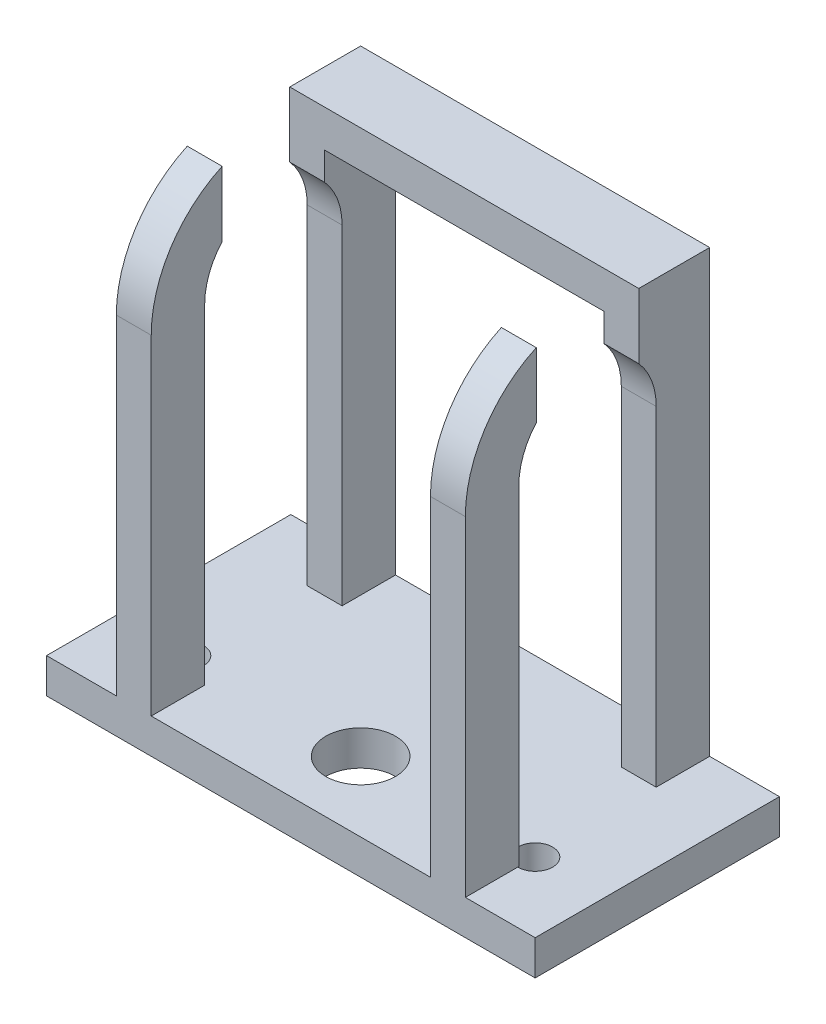
ISO-10303-21;
HEADER;
FILE_DESCRIPTION(('STEP AP214'),'2;1');
FILE_NAME('part.step','',(''),(''),'','','');
FILE_SCHEMA(('AUTOMOTIVE_DESIGN { 1 0 10303 214 1 1 1 1 }'));
ENDSEC;
DATA;
#1=APPLICATION_CONTEXT('core data for automotive mechanical design processes');
#2=APPLICATION_PROTOCOL_DEFINITION('international standard','automotive_design',2000,#1);
#3=PRODUCT_CONTEXT('',#1,'mechanical');
#4=PRODUCT('Part','Part','',(#3));
#5=PRODUCT_RELATED_PRODUCT_CATEGORY('part','',(#4));
#6=PRODUCT_DEFINITION_FORMATION('','',#4);
#7=PRODUCT_DEFINITION_CONTEXT('part definition',#1,'design');
#8=PRODUCT_DEFINITION('design','',#6,#7);
#9=PRODUCT_DEFINITION_SHAPE('','',#8);
#10=(LENGTH_UNIT() NAMED_UNIT(*) SI_UNIT(.MILLI.,.METRE.));
#11=(NAMED_UNIT(*) PLANE_ANGLE_UNIT() SI_UNIT($,.RADIAN.));
#12=(NAMED_UNIT(*) SI_UNIT($,.STERADIAN.) SOLID_ANGLE_UNIT());
#13=UNCERTAINTY_MEASURE_WITH_UNIT(LENGTH_MEASURE(1.E-05),#10,'distance_accuracy_value','');
#14=(GEOMETRIC_REPRESENTATION_CONTEXT(3) GLOBAL_UNCERTAINTY_ASSIGNED_CONTEXT((#13)) GLOBAL_UNIT_ASSIGNED_CONTEXT((#10,
#11,#12)) REPRESENTATION_CONTEXT('',''));
#15=CARTESIAN_POINT('',(0.,0.,0.));
#16=DIRECTION('',(0.,0.,1.));
#17=DIRECTION('',(1.,0.,0.));
#18=AXIS2_PLACEMENT_3D('',#15,#16,#17);
#19=CARTESIAN_POINT('',(-31.75,6.35,12.7));
#20=DIRECTION('',(0.,-1.,0.));
#21=DIRECTION('',(0.,0.,-1.));
#22=AXIS2_PLACEMENT_3D('',#19,#20,#21);
#23=PLANE('',#22);
#24=DIRECTION('',(0.,0.,-1.));
#25=VECTOR('',#24,1.);
#26=CARTESIAN_POINT('',(-31.75,6.35,12.7));
#27=LINE('',#26,#25);
#28=CARTESIAN_POINT('',(-31.75,6.35,3.175));
#29=VERTEX_POINT('',#28);
#30=CARTESIAN_POINT('',(-31.75,6.35,2.97499999999997));
#31=VERTEX_POINT('',#30);
#32=EDGE_CURVE('E618',#29,#31,#27,.T.);
#33=ORIENTED_EDGE('',*,*,#32,.T.);
#34=DIRECTION('',(-1.,0.,0.));
#35=VECTOR('',#34,1.);
#36=CARTESIAN_POINT('',(90.4,6.35,2.97499999999997));
#37=LINE('',#36,#35);
#38=CARTESIAN_POINT('',(-30.640946349359,6.35,2.97499999999997));
#39=VERTEX_POINT('',#38);
#40=EDGE_CURVE('E597',#39,#31,#37,.T.);
#41=ORIENTED_EDGE('',*,*,#40,.F.);
#42=CARTESIAN_POINT('',(-31.75,6.35,0.));
#43=DIRECTION('',(0.,1.,0.));
#44=DIRECTION('',(0.,0.,1.));
#45=AXIS2_PLACEMENT_3D('',#42,#43,#44);
#46=CIRCLE('',#45,3.175);
#47=EDGE_CURVE('E423',#29,#39,#46,.T.);
#48=ORIENTED_EDGE('',*,*,#47,.F.);
#49=EDGE_LOOP('',(#33,#41,#48));
#50=FACE_BOUND('',#49,.T.);
#51=ADVANCED_FACE('F176',(#50),#23,.T.);
#52=CARTESIAN_POINT('',(-31.75,0.,0.));
#53=DIRECTION('',(-1.,0.,0.));
#54=DIRECTION('',(0.,0.,-1.));
#55=AXIS2_PLACEMENT_3D('',#52,#53,#54);
#56=PLANE('',#55);
#57=CARTESIAN_POINT('',(-31.75,66.35,-9.52500000000002));
#58=DIRECTION('',(1.,0.,0.));
#59=DIRECTION('',(0.,0.,-1.));
#60=AXIS2_PLACEMENT_3D('',#57,#58,#59);
#61=CIRCLE('',#60,12.5);
#62=CARTESIAN_POINT('',(-31.75,74.6743242969024,-0.199999999999997));
#63=VERTEX_POINT('',#62);
#64=CARTESIAN_POINT('',(-31.75,66.35,2.97499999999998));
#65=VERTEX_POINT('',#64);
#66=EDGE_CURVE('E580',#63,#65,#61,.T.);
#67=ORIENTED_EDGE('',*,*,#66,.T.);
#68=DIRECTION('',(0.,-1.,0.));
#69=VECTOR('',#68,1.);
#70=CARTESIAN_POINT('',(-31.75,66.35,2.97499999999998));
#71=LINE('',#70,#69);
#72=EDGE_CURVE('E587',#65,#31,#71,.T.);
#73=ORIENTED_EDGE('',*,*,#72,.T.);
#74=ORIENTED_EDGE('',*,*,#32,.F.);
#75=CARTESIAN_POINT('',(-31.75,6.35,12.7));
#76=VERTEX_POINT('',#75);
#77=EDGE_CURVE('E559',#76,#29,#27,.T.);
#78=ORIENTED_EDGE('',*,*,#77,.F.);
#79=DIRECTION('',(0.,1.,0.));
#80=VECTOR('',#79,1.);
#81=CARTESIAN_POINT('',(-31.75,6.35,12.7));
#82=LINE('',#81,#80);
#83=CARTESIAN_POINT('',(-31.75,66.35,12.7));
#84=VERTEX_POINT('',#83);
#85=EDGE_CURVE('E613',#76,#84,#82,.T.);
#86=ORIENTED_EDGE('',*,*,#85,.T.);
#87=CARTESIAN_POINT('',(-31.75,66.35,-9.52500000000002));
#88=DIRECTION('',(1.,0.,0.));
#89=DIRECTION('',(0.,0.,-1.));
#90=AXIS2_PLACEMENT_3D('',#87,#88,#89);
#91=CIRCLE('',#90,22.225);
#92=CARTESIAN_POINT('',(-31.75,86.5241170810522,-0.200000000000002));
#93=VERTEX_POINT('',#92);
#94=EDGE_CURVE('E609',#93,#84,#91,.T.);
#95=ORIENTED_EDGE('',*,*,#94,.F.);
#96=DIRECTION('',(0.,1.,0.));
#97=VECTOR('',#96,1.);
#98=CARTESIAN_POINT('',(-31.75,74.6743242969024,-0.199999999999999));
#99=LINE('',#98,#97);
#100=EDGE_CURVE('E565',#63,#93,#99,.T.);
#101=ORIENTED_EDGE('',*,*,#100,.F.);
#102=EDGE_LOOP('',(#67,#73,#74,#78,#86,#95,#101));
#103=FACE_BOUND('',#102,.T.);
#104=ADVANCED_FACE('F651',(#103),#56,.T.);
#105=CARTESIAN_POINT('',(-25.4,0.,0.));
#106=DIRECTION('',(-1.,0.,0.));
#107=DIRECTION('',(0.,0.,-1.));
#108=AXIS2_PLACEMENT_3D('',#105,#106,#107);
#109=PLANE('',#108);
#110=DIRECTION('',(0.,1.,0.));
#111=VECTOR('',#110,1.);
#112=CARTESIAN_POINT('',(-25.4,66.35,2.97499999999998));
#113=LINE('',#112,#111);
#114=CARTESIAN_POINT('',(-25.4,6.35,2.97499999999997));
#115=VERTEX_POINT('',#114);
#116=CARTESIAN_POINT('',(-25.4,66.35,2.97499999999998));
#117=VERTEX_POINT('',#116);
#118=EDGE_CURVE('E591',#115,#117,#113,.T.);
#119=ORIENTED_EDGE('',*,*,#118,.T.);
#120=CARTESIAN_POINT('',(-25.4,66.35,-9.52500000000002));
#121=DIRECTION('',(-1.,0.,0.));
#122=DIRECTION('',(0.,0.,1.));
#123=AXIS2_PLACEMENT_3D('',#120,#121,#122);
#124=CIRCLE('',#123,12.5);
#125=CARTESIAN_POINT('',(-25.4,74.6743242969024,-0.199999999999999));
#126=VERTEX_POINT('',#125);
#127=EDGE_CURVE('E583',#117,#126,#124,.T.);
#128=ORIENTED_EDGE('',*,*,#127,.T.);
#129=DIRECTION('',(0.,-1.,0.));
#130=VECTOR('',#129,1.);
#131=CARTESIAN_POINT('',(-25.4,74.6743242969024,-0.199999999999999));
#132=LINE('',#131,#130);
#133=CARTESIAN_POINT('',(-25.4,86.5241170810522,-0.199999999999999));
#134=VERTEX_POINT('',#133);
#135=EDGE_CURVE('E570',#134,#126,#132,.T.);
#136=ORIENTED_EDGE('',*,*,#135,.F.);
#137=CARTESIAN_POINT('',(-25.4,66.35,-9.52500000000002));
#138=DIRECTION('',(1.,0.,0.));
#139=DIRECTION('',(0.,0.,-1.));
#140=AXIS2_PLACEMENT_3D('',#137,#138,#139);
#141=CIRCLE('',#140,22.225);
#142=CARTESIAN_POINT('',(-25.4,66.35,12.7));
#143=VERTEX_POINT('',#142);
#144=EDGE_CURVE('E590',#134,#143,#141,.T.);
#145=ORIENTED_EDGE('',*,*,#144,.T.);
#146=DIRECTION('',(0.,1.,0.));
#147=VECTOR('',#146,1.);
#148=CARTESIAN_POINT('',(-25.4,6.35,12.7));
#149=LINE('',#148,#147);
#150=CARTESIAN_POINT('',(-25.4,6.35,12.7));
#151=VERTEX_POINT('',#150);
#152=EDGE_CURVE('E611',#151,#143,#149,.T.);
#153=ORIENTED_EDGE('',*,*,#152,.F.);
#154=DIRECTION('',(0.,0.,-1.));
#155=VECTOR('',#154,1.);
#156=CARTESIAN_POINT('',(-25.4,6.35,12.7));
#157=LINE('',#156,#155);
#158=EDGE_CURVE('E623',#151,#115,#157,.T.);
#159=ORIENTED_EDGE('',*,*,#158,.T.);
#160=EDGE_LOOP('',(#119,#128,#136,#145,#153,#159));
#161=FACE_BOUND('',#160,.T.);
#162=ADVANCED_FACE('F697',(#161),#109,.F.);
#163=CARTESIAN_POINT('',(-31.75,66.35,-9.52500000000002));
#164=DIRECTION('',(1.,0.,0.));
#165=DIRECTION('',(0.,0.,-1.));
#166=AXIS2_PLACEMENT_3D('',#163,#164,#165);
#167=CYLINDRICAL_SURFACE('',#166,22.225);
#168=DIRECTION('',(1.,0.,0.));
#169=VECTOR('',#168,1.);
#170=CARTESIAN_POINT('',(-31.75,86.5241170810522,-0.199999999999999));
#171=LINE('',#170,#169);
#172=EDGE_CURVE('E12',#93,#134,#171,.T.);
#173=ORIENTED_EDGE('',*,*,#172,.F.);
#174=ORIENTED_EDGE('',*,*,#94,.T.);
#175=DIRECTION('',(1.,0.,0.));
#176=VECTOR('',#175,1.);
#177=CARTESIAN_POINT('',(-31.75,66.35,12.7));
#178=LINE('',#177,#176);
#179=EDGE_CURVE('E490',#84,#143,#178,.T.);
#180=ORIENTED_EDGE('',*,*,#179,.T.);
#181=ORIENTED_EDGE('',*,*,#144,.F.);
#182=EDGE_LOOP('',(#173,#174,#180,#181));
#183=FACE_BOUND('',#182,.T.);
#184=ADVANCED_FACE('F755',(#183),#167,.T.);
#185=CARTESIAN_POINT('',(25.4,0.,0.));
#186=DIRECTION('',(1.,0.,0.));
#187=DIRECTION('',(0.,0.,-1.));
#188=AXIS2_PLACEMENT_3D('',#185,#186,#187);
#189=PLANE('',#188);
#190=DIRECTION('',(0.,-1.,0.));
#191=VECTOR('',#190,1.);
#192=CARTESIAN_POINT('',(25.4,74.6743242969024,-18.85));
#193=LINE('',#192,#191);
#194=CARTESIAN_POINT('',(25.4,79.7543242969024,-18.85));
#195=VERTEX_POINT('',#194);
#196=CARTESIAN_POINT('',(25.4,74.6743242969024,-18.85));
#197=VERTEX_POINT('',#196);
#198=EDGE_CURVE('E387',#195,#197,#193,.T.);
#199=ORIENTED_EDGE('',*,*,#198,.F.);
#200=DIRECTION('',(0.,0.,-1.));
#201=VECTOR('',#200,1.);
#202=CARTESIAN_POINT('',(25.4,79.7543242969024,0.));
#203=LINE('',#202,#201);
#204=CARTESIAN_POINT('',(25.4,79.7543242969024,-31.75));
#205=VERTEX_POINT('',#204);
#206=EDGE_CURVE('E375',#195,#205,#203,.T.);
#207=ORIENTED_EDGE('',*,*,#206,.T.);
#208=DIRECTION('',(0.,1.,0.));
#209=VECTOR('',#208,1.);
#210=CARTESIAN_POINT('',(25.4,6.35000000000001,-31.75));
#211=LINE('',#210,#209);
#212=CARTESIAN_POINT('',(25.4,6.35,-31.75));
#213=VERTEX_POINT('',#212);
#214=EDGE_CURVE('E385',#213,#205,#211,.T.);
#215=ORIENTED_EDGE('',*,*,#214,.F.);
#216=DIRECTION('',(0.,0.,-1.));
#217=VECTOR('',#216,1.);
#218=CARTESIAN_POINT('',(25.4,6.35,12.7));
#219=LINE('',#218,#217);
#220=CARTESIAN_POINT('',(25.4,6.35,-22.025));
#221=VERTEX_POINT('',#220);
#222=EDGE_CURVE('E394',#221,#213,#219,.T.);
#223=ORIENTED_EDGE('',*,*,#222,.F.);
#224=DIRECTION('',(0.,1.,0.));
#225=VECTOR('',#224,1.);
#226=CARTESIAN_POINT('',(25.4,66.35,-22.025));
#227=LINE('',#226,#225);
#228=CARTESIAN_POINT('',(25.4,66.35,-22.025));
#229=VERTEX_POINT('',#228);
#230=EDGE_CURVE('E500',#221,#229,#227,.T.);
#231=ORIENTED_EDGE('',*,*,#230,.T.);
#232=CARTESIAN_POINT('',(25.4,66.35,-9.52500000000002));
#233=DIRECTION('',(1.,0.,0.));
#234=DIRECTION('',(0.,0.,-1.));
#235=AXIS2_PLACEMENT_3D('',#232,#233,#234);
#236=CIRCLE('',#235,12.5);
#237=EDGE_CURVE('E524',#197,#229,#236,.F.);
#238=ORIENTED_EDGE('',*,*,#237,.F.);
#239=EDGE_LOOP('',(#199,#207,#215,#223,#231,#238));
#240=FACE_BOUND('',#239,.T.);
#241=ADVANCED_FACE('F383',(#240),#189,.F.);
#242=CARTESIAN_POINT('',(31.75,0.,0.));
#243=DIRECTION('',(1.,0.,0.));
#244=DIRECTION('',(0.,0.,-1.));
#245=AXIS2_PLACEMENT_3D('',#242,#243,#244);
#246=PLANE('',#245);
#247=DIRECTION('',(0.,1.,0.));
#248=VECTOR('',#247,1.);
#249=CARTESIAN_POINT('',(31.75,6.35000000000001,-31.75));
#250=LINE('',#249,#248);
#251=CARTESIAN_POINT('',(31.75,6.35000000000001,-31.75));
#252=VERTEX_POINT('',#251);
#253=CARTESIAN_POINT('',(31.75,86.5241170810522,-31.75));
#254=VERTEX_POINT('',#253);
#255=EDGE_CURVE('E409',#252,#254,#250,.T.);
#256=ORIENTED_EDGE('',*,*,#255,.T.);
#257=DIRECTION('',(0.,0.,-1.));
#258=VECTOR('',#257,1.);
#259=CARTESIAN_POINT('',(31.75,86.5241170810522,-18.85));
#260=LINE('',#259,#258);
#261=CARTESIAN_POINT('',(31.75,86.5241170810522,-18.85));
#262=VERTEX_POINT('',#261);
#263=EDGE_CURVE('E478',#262,#254,#260,.T.);
#264=ORIENTED_EDGE('',*,*,#263,.F.);
#265=DIRECTION('',(0.,1.,0.));
#266=VECTOR('',#265,1.);
#267=CARTESIAN_POINT('',(31.75,74.6743242969024,-18.85));
#268=LINE('',#267,#266);
#269=CARTESIAN_POINT('',(31.75,74.6743242969024,-18.85));
#270=VERTEX_POINT('',#269);
#271=EDGE_CURVE('E486',#270,#262,#268,.T.);
#272=ORIENTED_EDGE('',*,*,#271,.F.);
#273=CARTESIAN_POINT('',(31.75,66.35,-9.52500000000002));
#274=DIRECTION('',(1.,0.,0.));
#275=DIRECTION('',(0.,0.,-1.));
#276=AXIS2_PLACEMENT_3D('',#273,#274,#275);
#277=CIRCLE('',#276,12.5);
#278=CARTESIAN_POINT('',(31.75,66.35,-22.025));
#279=VERTEX_POINT('',#278);
#280=EDGE_CURVE('E519',#279,#270,#277,.T.);
#281=ORIENTED_EDGE('',*,*,#280,.F.);
#282=DIRECTION('',(0.,-1.,0.));
#283=VECTOR('',#282,1.);
#284=CARTESIAN_POINT('',(31.75,66.35,-22.025));
#285=LINE('',#284,#283);
#286=CARTESIAN_POINT('',(31.75,6.35,-22.025));
#287=VERTEX_POINT('',#286);
#288=EDGE_CURVE('E501',#279,#287,#285,.T.);
#289=ORIENTED_EDGE('',*,*,#288,.T.);
#290=DIRECTION('',(0.,0.,-1.));
#291=VECTOR('',#290,1.);
#292=CARTESIAN_POINT('',(31.75,6.35,12.7));
#293=LINE('',#292,#291);
#294=EDGE_CURVE('E470',#287,#252,#293,.T.);
#295=ORIENTED_EDGE('',*,*,#294,.T.);
#296=EDGE_LOOP('',(#256,#264,#272,#281,#289,#295));
#297=FACE_BOUND('',#296,.T.);
#298=ADVANCED_FACE('F484',(#297),#246,.T.);
#299=CARTESIAN_POINT('',(31.75,66.35,-9.52500000000002));
#300=DIRECTION('',(-1.,0.,0.));
#301=DIRECTION('',(0.,0.,1.));
#302=AXIS2_PLACEMENT_3D('',#299,#300,#301);
#303=CYLINDRICAL_SURFACE('',#302,22.225);
#304=DIRECTION('',(-1.,0.,0.));
#305=VECTOR('',#304,1.);
#306=CARTESIAN_POINT('',(31.75,86.5241170810522,-0.199999999999999));
#307=LINE('',#306,#305);
#308=CARTESIAN_POINT('',(25.4,86.5241170810522,-0.200000000000002));
#309=VERTEX_POINT('',#308);
#310=CARTESIAN_POINT('',(31.75,86.5241170810522,-0.199999999999999));
#311=VERTEX_POINT('',#310);
#312=EDGE_CURVE('E471',#309,#311,#307,.F.);
#313=ORIENTED_EDGE('',*,*,#312,.F.);
#314=CARTESIAN_POINT('',(25.4,66.35,-9.52500000000002));
#315=DIRECTION('',(1.,0.,0.));
#316=DIRECTION('',(0.,0.,-1.));
#317=AXIS2_PLACEMENT_3D('',#314,#315,#316);
#318=CIRCLE('',#317,22.225);
#319=CARTESIAN_POINT('',(25.4,66.35,12.7));
#320=VERTEX_POINT('',#319);
#321=EDGE_CURVE('E399',#309,#320,#318,.T.);
#322=ORIENTED_EDGE('',*,*,#321,.T.);
#323=DIRECTION('',(-1.,0.,0.));
#324=VECTOR('',#323,1.);
#325=CARTESIAN_POINT('',(31.75,66.35,12.7));
#326=LINE('',#325,#324);
#327=CARTESIAN_POINT('',(31.75,66.35,12.7));
#328=VERTEX_POINT('',#327);
#329=EDGE_CURVE('E410',#328,#320,#326,.T.);
#330=ORIENTED_EDGE('',*,*,#329,.F.);
#331=CARTESIAN_POINT('',(31.75,66.35,-9.52500000000002));
#332=DIRECTION('',(1.,0.,0.));
#333=DIRECTION('',(0.,0.,-1.));
#334=AXIS2_PLACEMENT_3D('',#331,#332,#333);
#335=CIRCLE('',#334,22.225);
#336=EDGE_CURVE('E395',#311,#328,#335,.T.);
#337=ORIENTED_EDGE('',*,*,#336,.F.);
#338=EDGE_LOOP('',(#313,#322,#330,#337));
#339=FACE_BOUND('',#338,.T.);
#340=ADVANCED_FACE('F728',(#339),#303,.T.);
#341=CARTESIAN_POINT('',(0.,6.35,0.));
#342=DIRECTION('',(0.,-1.,0.));
#343=DIRECTION('',(0.,0.,-1.));
#344=AXIS2_PLACEMENT_3D('',#341,#342,#343);
#345=PLANE('',#344);
#346=DIRECTION('',(1.,0.,0.));
#347=VECTOR('',#346,1.);
#348=CARTESIAN_POINT('',(-44.45,6.35,12.7));
#349=LINE('',#348,#347);
#350=CARTESIAN_POINT('',(-44.45,6.35,12.7));
#351=VERTEX_POINT('',#350);
#352=EDGE_CURVE('E447',#351,#76,#349,.T.);
#353=ORIENTED_EDGE('',*,*,#352,.T.);
#354=ORIENTED_EDGE('',*,*,#77,.T.);
#355=EDGE_CURVE('E427',#39,#29,#46,.T.);
#356=ORIENTED_EDGE('',*,*,#355,.F.);
#357=EDGE_CURVE('E604',#115,#39,#37,.T.);
#358=ORIENTED_EDGE('',*,*,#357,.F.);
#359=ORIENTED_EDGE('',*,*,#158,.F.);
#360=CARTESIAN_POINT('',(25.4,6.35,12.7));
#361=VERTEX_POINT('',#360);
#362=EDGE_CURVE('E451',#151,#361,#349,.T.);
#363=ORIENTED_EDGE('',*,*,#362,.T.);
#364=CARTESIAN_POINT('',(25.4,6.35,2.97499999999997));
#365=VERTEX_POINT('',#364);
#366=EDGE_CURVE('E397',#361,#365,#219,.T.);
#367=ORIENTED_EDGE('',*,*,#366,.T.);
#368=DIRECTION('',(1.,0.,0.));
#369=VECTOR('',#368,1.);
#370=CARTESIAN_POINT('',(-39.6,6.35,2.97499999999997));
#371=LINE('',#370,#369);
#372=CARTESIAN_POINT('',(30.640946349359,6.35,2.97499999999997));
#373=VERTEX_POINT('',#372);
#374=EDGE_CURVE('E508',#365,#373,#371,.T.);
#375=ORIENTED_EDGE('',*,*,#374,.T.);
#376=CARTESIAN_POINT('',(31.75,6.35,0.));
#377=DIRECTION('',(0.,1.,0.));
#378=DIRECTION('',(0.,0.,-1.));
#379=AXIS2_PLACEMENT_3D('',#376,#377,#378);
#380=CIRCLE('',#379,3.175);
#381=CARTESIAN_POINT('',(31.75,6.35,3.17499999999999));
#382=VERTEX_POINT('',#381);
#383=EDGE_CURVE('E416',#382,#373,#380,.T.);
#384=ORIENTED_EDGE('',*,*,#383,.F.);
#385=CARTESIAN_POINT('',(31.75,6.35,12.7));
#386=VERTEX_POINT('',#385);
#387=EDGE_CURVE('E538',#386,#382,#293,.T.);
#388=ORIENTED_EDGE('',*,*,#387,.F.);
#389=CARTESIAN_POINT('',(44.45,6.35,12.7));
#390=VERTEX_POINT('',#389);
#391=EDGE_CURVE('E446',#386,#390,#349,.T.);
#392=ORIENTED_EDGE('',*,*,#391,.T.);
#393=DIRECTION('',(0.,0.,-1.));
#394=VECTOR('',#393,1.);
#395=CARTESIAN_POINT('',(44.45,6.35,12.7));
#396=LINE('',#395,#394);
#397=CARTESIAN_POINT('',(44.45,6.35,-31.75));
#398=VERTEX_POINT('',#397);
#399=EDGE_CURVE('E436',#390,#398,#396,.T.);
#400=ORIENTED_EDGE('',*,*,#399,.T.);
#401=DIRECTION('',(-1.,0.,0.));
#402=VECTOR('',#401,1.);
#403=CARTESIAN_POINT('',(-44.45,6.35,-31.75));
#404=LINE('',#403,#402);
#405=EDGE_CURVE('E441',#398,#252,#404,.T.);
#406=ORIENTED_EDGE('',*,*,#405,.T.);
#407=ORIENTED_EDGE('',*,*,#294,.F.);
#408=DIRECTION('',(1.,0.,0.));
#409=VECTOR('',#408,1.);
#410=CARTESIAN_POINT('',(-39.6,6.35,-22.025));
#411=LINE('',#410,#409);
#412=EDGE_CURVE('E507',#221,#287,#411,.T.);
#413=ORIENTED_EDGE('',*,*,#412,.F.);
#414=ORIENTED_EDGE('',*,*,#222,.T.);
#415=CARTESIAN_POINT('',(-25.4,6.35000000000001,-31.75));
#416=VERTEX_POINT('',#415);
#417=EDGE_CURVE('E393',#213,#416,#404,.T.);
#418=ORIENTED_EDGE('',*,*,#417,.T.);
#419=CARTESIAN_POINT('',(-25.4,6.35,-22.025));
#420=VERTEX_POINT('',#419);
#421=EDGE_CURVE('E622',#420,#416,#157,.T.);
#422=ORIENTED_EDGE('',*,*,#421,.F.);
#423=DIRECTION('',(-1.,0.,0.));
#424=VECTOR('',#423,1.);
#425=CARTESIAN_POINT('',(90.4,6.35,-22.025));
#426=LINE('',#425,#424);
#427=CARTESIAN_POINT('',(-31.75,6.35,-22.025));
#428=VERTEX_POINT('',#427);
#429=EDGE_CURVE('E598',#420,#428,#426,.T.);
#430=ORIENTED_EDGE('',*,*,#429,.T.);
#431=CARTESIAN_POINT('',(-31.75,6.35000000000001,-31.75));
#432=VERTEX_POINT('',#431);
#433=EDGE_CURVE('E616',#428,#432,#27,.T.);
#434=ORIENTED_EDGE('',*,*,#433,.T.);
#435=CARTESIAN_POINT('',(-44.45,6.35,-31.75));
#436=VERTEX_POINT('',#435);
#437=EDGE_CURVE('E439',#432,#436,#404,.T.);
#438=ORIENTED_EDGE('',*,*,#437,.T.);
#439=DIRECTION('',(0.,0.,1.));
#440=VECTOR('',#439,1.);
#441=CARTESIAN_POINT('',(-44.45,6.35,12.7));
#442=LINE('',#441,#440);
#443=EDGE_CURVE('E444',#436,#351,#442,.T.);
#444=ORIENTED_EDGE('',*,*,#443,.T.);
#445=EDGE_LOOP('',(#353,#354,#356,#358,#359,#363,#367,#375,#384,#388,#392,#400,#406,#407,#413,
#414,#418,#422,#430,#434,#438,#444));
#446=FACE_BOUND('',#445,.T.);
#447=CARTESIAN_POINT('',(0.,6.35,0.));
#448=DIRECTION('',(0.,1.,0.));
#449=DIRECTION('',(0.,0.,1.));
#450=AXIS2_PLACEMENT_3D('',#447,#448,#449);
#451=CIRCLE('',#450,6.35);
#452=CARTESIAN_POINT('',(0.,6.35,6.35));
#453=VERTEX_POINT('',#452);
#454=EDGE_CURVE('E430',#453,#453,#451,.T.);
#455=ORIENTED_EDGE('',*,*,#454,.F.);
#456=EDGE_LOOP('',(#455));
#457=FACE_BOUND('',#456,.T.);
#458=ADVANCED_FACE('F548',(#446,#457),#345,.F.);
#459=CARTESIAN_POINT('',(0.,0.,0.));
#460=DIRECTION('',(0.,-1.,0.));
#461=DIRECTION('',(0.,0.,-1.));
#462=AXIS2_PLACEMENT_3D('',#459,#460,#461);
#463=PLANE('',#462);
#464=CARTESIAN_POINT('',(-31.75,0.,0.));
#465=DIRECTION('',(0.,1.,0.));
#466=DIRECTION('',(0.,0.,1.));
#467=AXIS2_PLACEMENT_3D('',#464,#465,#466);
#468=CIRCLE('',#467,3.175);
#469=CARTESIAN_POINT('',(-31.75,0.,3.175));
#470=VERTEX_POINT('',#469);
#471=EDGE_CURVE('E419',#470,#470,#468,.T.);
#472=ORIENTED_EDGE('',*,*,#471,.T.);
#473=EDGE_LOOP('',(#472));
#474=FACE_BOUND('',#473,.T.);
#475=DIRECTION('',(0.,0.,-1.));
#476=VECTOR('',#475,1.);
#477=CARTESIAN_POINT('',(44.45,0.,12.7));
#478=LINE('',#477,#476);
#479=CARTESIAN_POINT('',(44.45,0.,12.7));
#480=VERTEX_POINT('',#479);
#481=CARTESIAN_POINT('',(44.45,0.,-31.75));
#482=VERTEX_POINT('',#481);
#483=EDGE_CURVE('E433',#480,#482,#478,.T.);
#484=ORIENTED_EDGE('',*,*,#483,.F.);
#485=DIRECTION('',(1.,0.,0.));
#486=VECTOR('',#485,1.);
#487=CARTESIAN_POINT('',(-44.45,0.,12.7));
#488=LINE('',#487,#486);
#489=CARTESIAN_POINT('',(-44.45,0.,12.7));
#490=VERTEX_POINT('',#489);
#491=EDGE_CURVE('E440',#490,#480,#488,.T.);
#492=ORIENTED_EDGE('',*,*,#491,.F.);
#493=DIRECTION('',(0.,0.,1.));
#494=VECTOR('',#493,1.);
#495=CARTESIAN_POINT('',(-44.45,0.,12.7));
#496=LINE('',#495,#494);
#497=CARTESIAN_POINT('',(-44.45,0.,-31.75));
#498=VERTEX_POINT('',#497);
#499=EDGE_CURVE('E456',#498,#490,#496,.T.);
#500=ORIENTED_EDGE('',*,*,#499,.F.);
#501=DIRECTION('',(-1.,0.,0.));
#502=VECTOR('',#501,1.);
#503=CARTESIAN_POINT('',(-44.45,0.,-31.75));
#504=LINE('',#503,#502);
#505=EDGE_CURVE('E454',#482,#498,#504,.T.);
#506=ORIENTED_EDGE('',*,*,#505,.F.);
#507=EDGE_LOOP('',(#484,#492,#500,#506));
#508=FACE_BOUND('',#507,.T.);
#509=CARTESIAN_POINT('',(0.,0.,0.));
#510=DIRECTION('',(0.,1.,0.));
#511=DIRECTION('',(0.,0.,1.));
#512=AXIS2_PLACEMENT_3D('',#509,#510,#511);
#513=CIRCLE('',#512,6.35);
#514=CARTESIAN_POINT('',(0.,0.,6.35));
#515=VERTEX_POINT('',#514);
#516=EDGE_CURVE('E426',#515,#515,#513,.T.);
#517=ORIENTED_EDGE('',*,*,#516,.T.);
#518=EDGE_LOOP('',(#517));
#519=FACE_BOUND('',#518,.T.);
#520=CARTESIAN_POINT('',(31.75,0.,0.));
#521=DIRECTION('',(0.,1.,0.));
#522=DIRECTION('',(0.,0.,-1.));
#523=AXIS2_PLACEMENT_3D('',#520,#521,#522);
#524=CIRCLE('',#523,3.175);
#525=CARTESIAN_POINT('',(31.75,0.,-3.17500000000001));
#526=VERTEX_POINT('',#525);
#527=EDGE_CURVE('E412',#526,#526,#524,.T.);
#528=ORIENTED_EDGE('',*,*,#527,.T.);
#529=EDGE_LOOP('',(#528));
#530=FACE_BOUND('',#529,.T.);
#531=ADVANCED_FACE('F666',(#474,#508,#519,#530),#463,.T.);
#532=CARTESIAN_POINT('',(44.45,6.35,12.7));
#533=DIRECTION('',(-1.,0.,0.));
#534=DIRECTION('',(0.,0.,1.));
#535=AXIS2_PLACEMENT_3D('',#532,#533,#534);
#536=PLANE('',#535);
#537=ORIENTED_EDGE('',*,*,#483,.T.);
#538=DIRECTION('',(0.,-1.,0.));
#539=VECTOR('',#538,1.);
#540=CARTESIAN_POINT('',(44.45,6.35,-31.75));
#541=LINE('',#540,#539);
#542=EDGE_CURVE('E467',#398,#482,#541,.T.);
#543=ORIENTED_EDGE('',*,*,#542,.F.);
#544=ORIENTED_EDGE('',*,*,#399,.F.);
#545=DIRECTION('',(0.,-1.,0.));
#546=VECTOR('',#545,1.);
#547=CARTESIAN_POINT('',(44.45,6.35,12.7));
#548=LINE('',#547,#546);
#549=EDGE_CURVE('E450',#390,#480,#548,.T.);
#550=ORIENTED_EDGE('',*,*,#549,.T.);
#551=EDGE_LOOP('',(#537,#543,#544,#550));
#552=FACE_BOUND('',#551,.T.);
#553=ADVANCED_FACE('F178',(#552),#536,.F.);
#554=CARTESIAN_POINT('',(-44.45,6.35,-31.75));
#555=DIRECTION('',(0.,0.,1.));
#556=DIRECTION('',(1.,0.,0.));
#557=AXIS2_PLACEMENT_3D('',#554,#555,#556);
#558=PLANE('',#557);
#559=DIRECTION('',(0.,1.,0.));
#560=VECTOR('',#559,1.);
#561=CARTESIAN_POINT('',(-31.75,6.35000000000001,-31.75));
#562=LINE('',#561,#560);
#563=CARTESIAN_POINT('',(-31.75,86.5241170810522,-31.75));
#564=VERTEX_POINT('',#563);
#565=EDGE_CURVE('E494',#432,#564,#562,.T.);
#566=ORIENTED_EDGE('',*,*,#565,.T.);
#567=DIRECTION('',(1.,0.,0.));
#568=VECTOR('',#567,1.);
#569=CARTESIAN_POINT('',(7.88350523000427,86.5241170810522,-31.75));
#570=LINE('',#569,#568);
#571=EDGE_CURVE('E489',#564,#254,#570,.T.);
#572=ORIENTED_EDGE('',*,*,#571,.T.);
#573=ORIENTED_EDGE('',*,*,#255,.F.);
#574=ORIENTED_EDGE('',*,*,#405,.F.);
#575=ORIENTED_EDGE('',*,*,#542,.T.);
#576=ORIENTED_EDGE('',*,*,#505,.T.);
#577=DIRECTION('',(0.,-1.,0.));
#578=VECTOR('',#577,1.);
#579=CARTESIAN_POINT('',(-44.45,6.35,-31.75));
#580=LINE('',#579,#578);
#581=EDGE_CURVE('E464',#436,#498,#580,.T.);
#582=ORIENTED_EDGE('',*,*,#581,.F.);
#583=ORIENTED_EDGE('',*,*,#437,.F.);
#584=EDGE_LOOP('',(#566,#572,#573,#574,#575,#576,#582,#583));
#585=FACE_BOUND('',#584,.T.);
#586=ORIENTED_EDGE('',*,*,#214,.T.);
#587=DIRECTION('',(1.,0.,0.));
#588=VECTOR('',#587,1.);
#589=CARTESIAN_POINT('',(-39.968462319007,79.7543242969024,-31.75));
#590=LINE('',#589,#588);
#591=CARTESIAN_POINT('',(-25.4,79.7543242969024,-31.75));
#592=VERTEX_POINT('',#591);
#593=EDGE_CURVE('E372',#592,#205,#590,.T.);
#594=ORIENTED_EDGE('',*,*,#593,.F.);
#595=DIRECTION('',(0.,1.,0.));
#596=VECTOR('',#595,1.);
#597=CARTESIAN_POINT('',(-25.4,6.35000000000001,-31.75));
#598=LINE('',#597,#596);
#599=EDGE_CURVE('E199',#416,#592,#598,.T.);
#600=ORIENTED_EDGE('',*,*,#599,.F.);
#601=ORIENTED_EDGE('',*,*,#417,.F.);
#602=EDGE_LOOP('',(#586,#594,#600,#601));
#603=FACE_BOUND('',#602,.T.);
#604=ADVANCED_FACE('F391',(#585,#603),#558,.F.);
#605=CARTESIAN_POINT('',(-44.45,6.35,12.7));
#606=DIRECTION('',(1.,0.,0.));
#607=DIRECTION('',(0.,0.,-1.));
#608=AXIS2_PLACEMENT_3D('',#605,#606,#607);
#609=PLANE('',#608);
#610=ORIENTED_EDGE('',*,*,#499,.T.);
#611=DIRECTION('',(0.,-1.,0.));
#612=VECTOR('',#611,1.);
#613=CARTESIAN_POINT('',(-44.45,6.35,12.7));
#614=LINE('',#613,#612);
#615=EDGE_CURVE('E461',#351,#490,#614,.T.);
#616=ORIENTED_EDGE('',*,*,#615,.F.);
#617=ORIENTED_EDGE('',*,*,#443,.F.);
#618=ORIENTED_EDGE('',*,*,#581,.T.);
#619=EDGE_LOOP('',(#610,#616,#617,#618));
#620=FACE_BOUND('',#619,.T.);
#621=ADVANCED_FACE('F634',(#620),#609,.F.);
#622=CARTESIAN_POINT('',(-44.45,6.35,12.7));
#623=DIRECTION('',(0.,0.,-1.));
#624=DIRECTION('',(-1.,0.,0.));
#625=AXIS2_PLACEMENT_3D('',#622,#623,#624);
#626=PLANE('',#625);
#627=ORIENTED_EDGE('',*,*,#491,.T.);
#628=ORIENTED_EDGE('',*,*,#549,.F.);
#629=ORIENTED_EDGE('',*,*,#391,.F.);
#630=DIRECTION('',(0.,1.,0.));
#631=VECTOR('',#630,1.);
#632=CARTESIAN_POINT('',(31.75,6.35,12.7));
#633=LINE('',#632,#631);
#634=EDGE_CURVE('E402',#386,#328,#633,.T.);
#635=ORIENTED_EDGE('',*,*,#634,.T.);
#636=ORIENTED_EDGE('',*,*,#329,.T.);
#637=DIRECTION('',(0.,1.,0.));
#638=VECTOR('',#637,1.);
#639=CARTESIAN_POINT('',(25.4,6.35,12.7));
#640=LINE('',#639,#638);
#641=EDGE_CURVE('E406',#361,#320,#640,.T.);
#642=ORIENTED_EDGE('',*,*,#641,.F.);
#643=ORIENTED_EDGE('',*,*,#362,.F.);
#644=ORIENTED_EDGE('',*,*,#152,.T.);
#645=ORIENTED_EDGE('',*,*,#179,.F.);
#646=ORIENTED_EDGE('',*,*,#85,.F.);
#647=ORIENTED_EDGE('',*,*,#352,.F.);
#648=ORIENTED_EDGE('',*,*,#615,.T.);
#649=EDGE_LOOP('',(#627,#628,#629,#635,#636,#642,#643,#644,#645,#646,#647,#648));
#650=FACE_BOUND('',#649,.T.);
#651=ADVANCED_FACE('F638',(#650),#626,.F.);
#652=CARTESIAN_POINT('',(0.,6.35,0.));
#653=DIRECTION('',(0.,-1.,0.));
#654=DIRECTION('',(0.,0.,-1.));
#655=AXIS2_PLACEMENT_3D('',#652,#653,#654);
#656=CYLINDRICAL_SURFACE('',#655,6.35);
#657=ORIENTED_EDGE('',*,*,#454,.T.);
#658=EDGE_LOOP('',(#657));
#659=FACE_BOUND('',#658,.T.);
#660=ORIENTED_EDGE('',*,*,#516,.F.);
#661=EDGE_LOOP('',(#660));
#662=FACE_BOUND('',#661,.T.);
#663=ADVANCED_FACE('F688',(#659,#662),#656,.F.);
#664=CARTESIAN_POINT('',(-31.75,6.35,0.));
#665=DIRECTION('',(0.,-1.,0.));
#666=DIRECTION('',(0.,0.,-1.));
#667=AXIS2_PLACEMENT_3D('',#664,#665,#666);
#668=CYLINDRICAL_SURFACE('',#667,3.175);
#669=ORIENTED_EDGE('',*,*,#47,.T.);
#670=ORIENTED_EDGE('',*,*,#355,.T.);
#671=EDGE_LOOP('',(#669,#670));
#672=FACE_BOUND('',#671,.T.);
#673=ORIENTED_EDGE('',*,*,#471,.F.);
#674=EDGE_LOOP('',(#673));
#675=FACE_BOUND('',#674,.T.);
#676=ADVANCED_FACE('F646',(#672,#675),#668,.F.);
#677=CARTESIAN_POINT('',(31.75,6.35,0.));
#678=DIRECTION('',(0.,-1.,0.));
#679=DIRECTION('',(0.,0.,-1.));
#680=AXIS2_PLACEMENT_3D('',#677,#678,#679);
#681=CYLINDRICAL_SURFACE('',#680,3.175);
#682=ORIENTED_EDGE('',*,*,#383,.T.);
#683=EDGE_CURVE('E420',#373,#382,#380,.T.);
#684=ORIENTED_EDGE('',*,*,#683,.T.);
#685=EDGE_LOOP('',(#682,#684));
#686=FACE_BOUND('',#685,.T.);
#687=ORIENTED_EDGE('',*,*,#527,.F.);
#688=EDGE_LOOP('',(#687));
#689=FACE_BOUND('',#688,.T.);
#690=ADVANCED_FACE('F675',(#686,#689),#681,.F.);
#691=CARTESIAN_POINT('',(31.75,6.35,12.7));
#692=DIRECTION('',(0.,1.,0.));
#693=DIRECTION('',(0.,0.,1.));
#694=AXIS2_PLACEMENT_3D('',#691,#692,#693);
#695=PLANE('',#694);
#696=ORIENTED_EDGE('',*,*,#683,.F.);
#697=CARTESIAN_POINT('',(31.75,6.35,2.97499999999997));
#698=VERTEX_POINT('',#697);
#699=EDGE_CURVE('E511',#373,#698,#371,.T.);
#700=ORIENTED_EDGE('',*,*,#699,.T.);
#701=EDGE_CURVE('E537',#382,#698,#293,.T.);
#702=ORIENTED_EDGE('',*,*,#701,.F.);
#703=EDGE_LOOP('',(#696,#700,#702));
#704=FACE_BOUND('',#703,.T.);
#705=ADVANCED_FACE('F677',(#704),#695,.F.);
#706=CARTESIAN_POINT('',(25.4,66.35,2.97499999999998));
#707=VERTEX_POINT('',#706);
#708=CARTESIAN_POINT('',(25.4,74.6743242969024,-0.200000000000004));
#709=VERTEX_POINT('',#708);
#710=EDGE_CURVE('E522',#707,#709,#236,.F.);
#711=ORIENTED_EDGE('',*,*,#710,.F.);
#712=DIRECTION('',(0.,1.,0.));
#713=VECTOR('',#712,1.);
#714=CARTESIAN_POINT('',(25.4,66.35,2.97499999999998));
#715=LINE('',#714,#713);
#716=EDGE_CURVE('E415',#365,#707,#715,.T.);
#717=ORIENTED_EDGE('',*,*,#716,.F.);
#718=ORIENTED_EDGE('',*,*,#366,.F.);
#719=ORIENTED_EDGE('',*,*,#641,.T.);
#720=ORIENTED_EDGE('',*,*,#321,.F.);
#721=DIRECTION('',(0.,-1.,0.));
#722=VECTOR('',#721,1.);
#723=CARTESIAN_POINT('',(25.4,74.6743242969024,-0.199999999999999));
#724=LINE('',#723,#722);
#725=EDGE_CURVE('E530',#309,#709,#724,.T.);
#726=ORIENTED_EDGE('',*,*,#725,.T.);
#727=EDGE_LOOP('',(#711,#717,#718,#719,#720,#726));
#728=FACE_BOUND('',#727,.T.);
#729=ADVANCED_FACE('F684',(#728),#189,.F.);
#730=DIRECTION('',(0.,-1.,0.));
#731=VECTOR('',#730,1.);
#732=CARTESIAN_POINT('',(31.75,66.35,2.97499999999998));
#733=LINE('',#732,#731);
#734=CARTESIAN_POINT('',(31.75,66.35,2.97499999999998));
#735=VERTEX_POINT('',#734);
#736=EDGE_CURVE('E504',#735,#698,#733,.T.);
#737=ORIENTED_EDGE('',*,*,#736,.F.);
#738=CARTESIAN_POINT('',(31.75,74.6743242969024,-0.200000000000011));
#739=VERTEX_POINT('',#738);
#740=EDGE_CURVE('E521',#739,#735,#277,.T.);
#741=ORIENTED_EDGE('',*,*,#740,.F.);
#742=DIRECTION('',(0.,1.,0.));
#743=VECTOR('',#742,1.);
#744=CARTESIAN_POINT('',(31.75,74.6743242969024,-0.199999999999999));
#745=LINE('',#744,#743);
#746=EDGE_CURVE('E532',#739,#311,#745,.T.);
#747=ORIENTED_EDGE('',*,*,#746,.T.);
#748=ORIENTED_EDGE('',*,*,#336,.T.);
#749=ORIENTED_EDGE('',*,*,#634,.F.);
#750=ORIENTED_EDGE('',*,*,#387,.T.);
#751=ORIENTED_EDGE('',*,*,#701,.T.);
#752=EDGE_LOOP('',(#737,#741,#747,#748,#749,#750,#751));
#753=FACE_BOUND('',#752,.T.);
#754=ADVANCED_FACE('F723',(#753),#246,.T.);
#755=CARTESIAN_POINT('',(-39.6,74.6743242969024,-18.85));
#756=DIRECTION('',(0.,0.,-1.));
#757=DIRECTION('',(0.,1.,0.));
#758=AXIS2_PLACEMENT_3D('',#755,#756,#757);
#759=PLANE('',#758);
#760=ORIENTED_EDGE('',*,*,#271,.T.);
#761=DIRECTION('',(-1.,0.,0.));
#762=VECTOR('',#761,1.);
#763=CARTESIAN_POINT('',(31.75,86.5241170810522,-18.85));
#764=LINE('',#763,#762);
#765=CARTESIAN_POINT('',(-31.75,86.5241170810522,-18.85));
#766=VERTEX_POINT('',#765);
#767=EDGE_CURVE('E184',#766,#262,#764,.F.);
#768=ORIENTED_EDGE('',*,*,#767,.F.);
#769=DIRECTION('',(0.,1.,0.));
#770=VECTOR('',#769,1.);
#771=CARTESIAN_POINT('',(-31.75,74.6743242969024,-18.85));
#772=LINE('',#771,#770);
#773=CARTESIAN_POINT('',(-31.75,74.6743242969024,-18.85));
#774=VERTEX_POINT('',#773);
#775=EDGE_CURVE('E564',#774,#766,#772,.T.);
#776=ORIENTED_EDGE('',*,*,#775,.F.);
#777=DIRECTION('',(-1.,0.,0.));
#778=VECTOR('',#777,1.);
#779=CARTESIAN_POINT('',(90.4,74.6743242969024,-18.85));
#780=LINE('',#779,#778);
#781=CARTESIAN_POINT('',(-25.4,74.6743242969024,-18.85));
#782=VERTEX_POINT('',#781);
#783=EDGE_CURVE('E575',#782,#774,#780,.T.);
#784=ORIENTED_EDGE('',*,*,#783,.F.);
#785=DIRECTION('',(0.,-1.,0.));
#786=VECTOR('',#785,1.);
#787=CARTESIAN_POINT('',(-25.4,74.6743242969024,-18.85));
#788=LINE('',#787,#786);
#789=CARTESIAN_POINT('',(-25.4,79.7543242969024,-18.85));
#790=VERTEX_POINT('',#789);
#791=EDGE_CURVE('E572',#790,#782,#788,.T.);
#792=ORIENTED_EDGE('',*,*,#791,.F.);
#793=DIRECTION('',(1.,0.,0.));
#794=VECTOR('',#793,1.);
#795=CARTESIAN_POINT('',(-39.968462319007,79.7543242969024,-18.85));
#796=LINE('',#795,#794);
#797=EDGE_CURVE('E191',#790,#195,#796,.T.);
#798=ORIENTED_EDGE('',*,*,#797,.T.);
#799=ORIENTED_EDGE('',*,*,#198,.T.);
#800=DIRECTION('',(1.,0.,0.));
#801=VECTOR('',#800,1.);
#802=CARTESIAN_POINT('',(-39.6,74.6743242969024,-18.85));
#803=LINE('',#802,#801);
#804=EDGE_CURVE('E525',#270,#197,#803,.F.);
#805=ORIENTED_EDGE('',*,*,#804,.F.);
#806=EDGE_LOOP('',(#760,#768,#776,#784,#792,#798,#799,#805));
#807=FACE_BOUND('',#806,.T.);
#808=ADVANCED_FACE('F719',(#807),#759,.F.);
#809=CARTESIAN_POINT('',(-39.6,74.6743242969024,-0.199999999999999));
#810=DIRECTION('',(0.,0.,-1.));
#811=DIRECTION('',(-1.,0.,0.));
#812=AXIS2_PLACEMENT_3D('',#809,#810,#811);
#813=PLANE('',#812);
#814=ORIENTED_EDGE('',*,*,#312,.T.);
#815=ORIENTED_EDGE('',*,*,#746,.F.);
#816=DIRECTION('',(1.,0.,0.));
#817=VECTOR('',#816,1.);
#818=CARTESIAN_POINT('',(-39.6,74.6743242969024,-0.200000000000011));
#819=LINE('',#818,#817);
#820=EDGE_CURVE('E505',#709,#739,#819,.T.);
#821=ORIENTED_EDGE('',*,*,#820,.F.);
#822=ORIENTED_EDGE('',*,*,#725,.F.);
#823=EDGE_LOOP('',(#814,#815,#821,#822));
#824=FACE_BOUND('',#823,.T.);
#825=ADVANCED_FACE('F709',(#824),#813,.T.);
#826=CARTESIAN_POINT('',(-39.6,66.35,2.97499999999998));
#827=DIRECTION('',(0.,0.,1.));
#828=DIRECTION('',(0.,-1.,0.));
#829=AXIS2_PLACEMENT_3D('',#826,#827,#828);
#830=PLANE('',#829);
#831=ORIENTED_EDGE('',*,*,#716,.T.);
#832=DIRECTION('',(1.,0.,0.));
#833=VECTOR('',#832,1.);
#834=CARTESIAN_POINT('',(-39.6,66.35,2.97499999999998));
#835=LINE('',#834,#833);
#836=EDGE_CURVE('E512',#707,#735,#835,.T.);
#837=ORIENTED_EDGE('',*,*,#836,.T.);
#838=ORIENTED_EDGE('',*,*,#736,.T.);
#839=ORIENTED_EDGE('',*,*,#699,.F.);
#840=ORIENTED_EDGE('',*,*,#374,.F.);
#841=EDGE_LOOP('',(#831,#837,#838,#839,#840));
#842=FACE_BOUND('',#841,.T.);
#843=ADVANCED_FACE('F705',(#842),#830,.F.);
#844=CARTESIAN_POINT('',(-39.6,66.35,-22.025));
#845=DIRECTION('',(0.,0.,1.));
#846=DIRECTION('',(0.,-1.,0.));
#847=AXIS2_PLACEMENT_3D('',#844,#845,#846);
#848=PLANE('',#847);
#849=ORIENTED_EDGE('',*,*,#412,.T.);
#850=ORIENTED_EDGE('',*,*,#288,.F.);
#851=DIRECTION('',(1.,0.,0.));
#852=VECTOR('',#851,1.);
#853=CARTESIAN_POINT('',(-39.6,66.35,-22.025));
#854=LINE('',#853,#852);
#855=EDGE_CURVE('E514',#229,#279,#854,.T.);
#856=ORIENTED_EDGE('',*,*,#855,.F.);
#857=ORIENTED_EDGE('',*,*,#230,.F.);
#858=EDGE_LOOP('',(#849,#850,#856,#857));
#859=FACE_BOUND('',#858,.T.);
#860=ADVANCED_FACE('F708',(#859),#848,.T.);
#861=CARTESIAN_POINT('',(-39.6,66.35,-9.52500000000002));
#862=DIRECTION('',(1.,0.,0.));
#863=DIRECTION('',(0.,0.,-1.));
#864=AXIS2_PLACEMENT_3D('',#861,#862,#863);
#865=CYLINDRICAL_SURFACE('',#864,12.5);
#866=ORIENTED_EDGE('',*,*,#710,.T.);
#867=ORIENTED_EDGE('',*,*,#820,.T.);
#868=ORIENTED_EDGE('',*,*,#740,.T.);
#869=ORIENTED_EDGE('',*,*,#836,.F.);
#870=EDGE_LOOP('',(#866,#867,#868,#869));
#871=FACE_BOUND('',#870,.T.);
#872=ADVANCED_FACE('F704',(#871),#865,.F.);
#873=ORIENTED_EDGE('',*,*,#855,.T.);
#874=ORIENTED_EDGE('',*,*,#280,.T.);
#875=ORIENTED_EDGE('',*,*,#804,.T.);
#876=ORIENTED_EDGE('',*,*,#237,.T.);
#877=EDGE_LOOP('',(#873,#874,#875,#876));
#878=FACE_BOUND('',#877,.T.);
#879=ADVANCED_FACE('F703',(#878),#865,.F.);
#880=CARTESIAN_POINT('',(7.88350523000427,86.5241170810522,-18.85));
#881=DIRECTION('',(0.,-1.,0.));
#882=DIRECTION('',(0.,0.,-1.));
#883=AXIS2_PLACEMENT_3D('',#880,#881,#882);
#884=PLANE('',#883);
#885=ORIENTED_EDGE('',*,*,#571,.F.);
#886=DIRECTION('',(0.,0.,-1.));
#887=VECTOR('',#886,1.);
#888=CARTESIAN_POINT('',(-31.75,86.5241170810522,-18.85));
#889=LINE('',#888,#887);
#890=EDGE_CURVE('E388',#766,#564,#889,.T.);
#891=ORIENTED_EDGE('',*,*,#890,.F.);
#892=ORIENTED_EDGE('',*,*,#767,.T.);
#893=ORIENTED_EDGE('',*,*,#263,.T.);
#894=EDGE_LOOP('',(#885,#891,#892,#893));
#895=FACE_BOUND('',#894,.T.);
#896=ADVANCED_FACE('F477',(#895),#884,.F.);
#897=DIRECTION('',(0.,-1.,0.));
#898=VECTOR('',#897,1.);
#899=CARTESIAN_POINT('',(-31.75,66.35,-22.025));
#900=LINE('',#899,#898);
#901=CARTESIAN_POINT('',(-31.75,66.35,-22.025));
#902=VERTEX_POINT('',#901);
#903=EDGE_CURVE('E594',#902,#428,#900,.T.);
#904=ORIENTED_EDGE('',*,*,#903,.F.);
#905=EDGE_CURVE('E571',#902,#774,#61,.T.);
#906=ORIENTED_EDGE('',*,*,#905,.T.);
#907=ORIENTED_EDGE('',*,*,#775,.T.);
#908=ORIENTED_EDGE('',*,*,#890,.T.);
#909=ORIENTED_EDGE('',*,*,#565,.F.);
#910=ORIENTED_EDGE('',*,*,#433,.F.);
#911=EDGE_LOOP('',(#904,#906,#907,#908,#909,#910));
#912=FACE_BOUND('',#911,.T.);
#913=ADVANCED_FACE('F562',(#912),#56,.T.);
#914=ORIENTED_EDGE('',*,*,#599,.T.);
#915=DIRECTION('',(0.,0.,-1.));
#916=VECTOR('',#915,1.);
#917=CARTESIAN_POINT('',(-25.4,79.7543242969024,-18.85));
#918=LINE('',#917,#916);
#919=EDGE_CURVE('E377',#790,#592,#918,.T.);
#920=ORIENTED_EDGE('',*,*,#919,.F.);
#921=ORIENTED_EDGE('',*,*,#791,.T.);
#922=CARTESIAN_POINT('',(-25.4,66.35,-22.025));
#923=VERTEX_POINT('',#922);
#924=EDGE_CURVE('E584',#782,#923,#124,.T.);
#925=ORIENTED_EDGE('',*,*,#924,.T.);
#926=DIRECTION('',(0.,1.,0.));
#927=VECTOR('',#926,1.);
#928=CARTESIAN_POINT('',(-25.4,66.35,-22.025));
#929=LINE('',#928,#927);
#930=EDGE_CURVE('E588',#420,#923,#929,.T.);
#931=ORIENTED_EDGE('',*,*,#930,.F.);
#932=ORIENTED_EDGE('',*,*,#421,.T.);
#933=EDGE_LOOP('',(#914,#920,#921,#925,#931,#932));
#934=FACE_BOUND('',#933,.T.);
#935=ADVANCED_FACE('F629',(#934),#109,.F.);
#936=CARTESIAN_POINT('',(90.4,66.35,2.97499999999998));
#937=DIRECTION('',(0.,0.,-1.));
#938=DIRECTION('',(0.,1.,0.));
#939=AXIS2_PLACEMENT_3D('',#936,#937,#938);
#940=PLANE('',#939);
#941=ORIENTED_EDGE('',*,*,#357,.T.);
#942=ORIENTED_EDGE('',*,*,#40,.T.);
#943=ORIENTED_EDGE('',*,*,#72,.F.);
#944=DIRECTION('',(-1.,0.,0.));
#945=VECTOR('',#944,1.);
#946=CARTESIAN_POINT('',(90.4,66.35,2.97499999999998));
#947=LINE('',#946,#945);
#948=EDGE_CURVE('E602',#117,#65,#947,.T.);
#949=ORIENTED_EDGE('',*,*,#948,.F.);
#950=ORIENTED_EDGE('',*,*,#118,.F.);
#951=EDGE_LOOP('',(#941,#942,#943,#949,#950));
#952=FACE_BOUND('',#951,.T.);
#953=ADVANCED_FACE('F656',(#952),#940,.T.);
#954=CARTESIAN_POINT('',(90.4,66.35,-22.025));
#955=DIRECTION('',(0.,0.,-1.));
#956=DIRECTION('',(0.,1.,0.));
#957=AXIS2_PLACEMENT_3D('',#954,#955,#956);
#958=PLANE('',#957);
#959=ORIENTED_EDGE('',*,*,#930,.T.);
#960=DIRECTION('',(-1.,0.,0.));
#961=VECTOR('',#960,1.);
#962=CARTESIAN_POINT('',(90.4,66.35,-22.025));
#963=LINE('',#962,#961);
#964=EDGE_CURVE('E600',#923,#902,#963,.T.);
#965=ORIENTED_EDGE('',*,*,#964,.T.);
#966=ORIENTED_EDGE('',*,*,#903,.T.);
#967=ORIENTED_EDGE('',*,*,#429,.F.);
#968=EDGE_LOOP('',(#959,#965,#966,#967));
#969=FACE_BOUND('',#968,.T.);
#970=ADVANCED_FACE('F776',(#969),#958,.F.);
#971=CARTESIAN_POINT('',(90.4,66.35,-9.52500000000002));
#972=DIRECTION('',(-1.,0.,0.));
#973=DIRECTION('',(0.,0.,1.));
#974=AXIS2_PLACEMENT_3D('',#971,#972,#973);
#975=CYLINDRICAL_SURFACE('',#974,12.5);
#976=ORIENTED_EDGE('',*,*,#948,.T.);
#977=ORIENTED_EDGE('',*,*,#66,.F.);
#978=DIRECTION('',(-1.,0.,0.));
#979=VECTOR('',#978,1.);
#980=CARTESIAN_POINT('',(90.4,74.6743242969024,-0.199999999999999));
#981=LINE('',#980,#979);
#982=EDGE_CURVE('E577',#126,#63,#981,.T.);
#983=ORIENTED_EDGE('',*,*,#982,.F.);
#984=ORIENTED_EDGE('',*,*,#127,.F.);
#985=EDGE_LOOP('',(#976,#977,#983,#984));
#986=FACE_BOUND('',#985,.T.);
#987=ADVANCED_FACE('F780',(#986),#975,.F.);
#988=ORIENTED_EDGE('',*,*,#964,.F.);
#989=ORIENTED_EDGE('',*,*,#924,.F.);
#990=ORIENTED_EDGE('',*,*,#783,.T.);
#991=ORIENTED_EDGE('',*,*,#905,.F.);
#992=EDGE_LOOP('',(#988,#989,#990,#991));
#993=FACE_BOUND('',#992,.T.);
#994=ADVANCED_FACE('F785',(#993),#975,.F.);
#995=CARTESIAN_POINT('',(90.4,74.6743242969024,-0.199999999999999));
#996=DIRECTION('',(0.,0.,1.));
#997=DIRECTION('',(1.,0.,0.));
#998=AXIS2_PLACEMENT_3D('',#995,#996,#997);
#999=PLANE('',#998);
#1000=ORIENTED_EDGE('',*,*,#172,.T.);
#1001=ORIENTED_EDGE('',*,*,#135,.T.);
#1002=ORIENTED_EDGE('',*,*,#982,.T.);
#1003=ORIENTED_EDGE('',*,*,#100,.T.);
#1004=EDGE_LOOP('',(#1000,#1001,#1002,#1003));
#1005=FACE_BOUND('',#1004,.T.);
#1006=ADVANCED_FACE('F790',(#1005),#999,.F.);
#1007=CARTESIAN_POINT('',(-39.968462319007,79.7543242969024,-18.85));
#1008=DIRECTION('',(0.,-1.,0.));
#1009=DIRECTION('',(0.,0.,-1.));
#1010=AXIS2_PLACEMENT_3D('',#1007,#1008,#1009);
#1011=PLANE('',#1010);
#1012=ORIENTED_EDGE('',*,*,#206,.F.);
#1013=ORIENTED_EDGE('',*,*,#797,.F.);
#1014=ORIENTED_EDGE('',*,*,#919,.T.);
#1015=ORIENTED_EDGE('',*,*,#593,.T.);
#1016=EDGE_LOOP('',(#1012,#1013,#1014,#1015));
#1017=FACE_BOUND('',#1016,.T.);
#1018=ADVANCED_FACE('F374',(#1017),#1011,.T.);
#1019=CLOSED_SHELL('',(#51,#104,#162,#184,#241,#298,#340,#458,#531,#553,#604,#621,#651,#663,
#676,#690,#705,#729,#754,#808,#825,#843,#860,#872,#879,#896,#913,#935,#953,#970,#987,#994,#1006,#1018));
#1020=MANIFOLD_SOLID_BREP('B2',#1019);
#1021=ADVANCED_BREP_SHAPE_REPRESENTATION('',(#18,#1020),#14);
#1022=SHAPE_DEFINITION_REPRESENTATION(#9,#1021);
ENDSEC;
END-ISO-10303-21;
